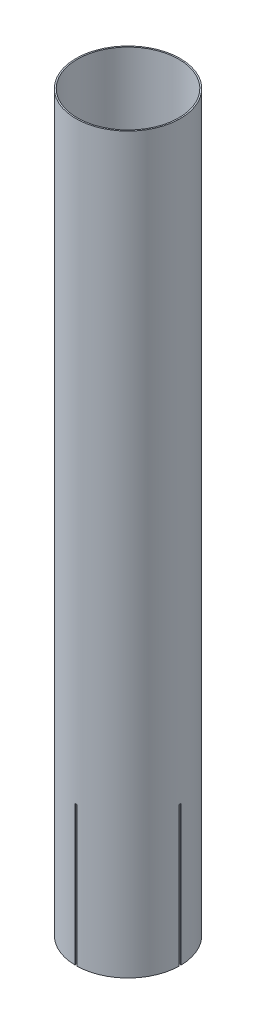
ISO-10303-21;
HEADER;
FILE_DESCRIPTION(('STEP AP214'),'2;1');
FILE_NAME('part.step','',(''),(''),'','','');
FILE_SCHEMA(('AUTOMOTIVE_DESIGN { 1 0 10303 214 1 1 1 1 }'));
ENDSEC;
DATA;
#1=APPLICATION_CONTEXT('core data for automotive mechanical design processes');
#2=APPLICATION_PROTOCOL_DEFINITION('international standard','automotive_design',2000,#1);
#3=PRODUCT_CONTEXT('',#1,'mechanical');
#4=PRODUCT('Part','Part','',(#3));
#5=PRODUCT_RELATED_PRODUCT_CATEGORY('part','',(#4));
#6=PRODUCT_DEFINITION_FORMATION('','',#4);
#7=PRODUCT_DEFINITION_CONTEXT('part definition',#1,'design');
#8=PRODUCT_DEFINITION('design','',#6,#7);
#9=PRODUCT_DEFINITION_SHAPE('','',#8);
#10=(LENGTH_UNIT() NAMED_UNIT(*) SI_UNIT(.MILLI.,.METRE.));
#11=(NAMED_UNIT(*) PLANE_ANGLE_UNIT() SI_UNIT($,.RADIAN.));
#12=(NAMED_UNIT(*) SI_UNIT($,.STERADIAN.) SOLID_ANGLE_UNIT());
#13=UNCERTAINTY_MEASURE_WITH_UNIT(LENGTH_MEASURE(1.E-05),#10,'distance_accuracy_value','');
#14=(GEOMETRIC_REPRESENTATION_CONTEXT(3) GLOBAL_UNCERTAINTY_ASSIGNED_CONTEXT((#13)) GLOBAL_UNIT_ASSIGNED_CONTEXT((#10,
#11,#12)) REPRESENTATION_CONTEXT('',''));
#15=CARTESIAN_POINT('',(0.,0.,0.));
#16=DIRECTION('',(0.,0.,1.));
#17=DIRECTION('',(1.,0.,0.));
#18=AXIS2_PLACEMENT_3D('',#15,#16,#17);
#19=CARTESIAN_POINT('',(78.2,0.,0.));
#20=DIRECTION('',(0.,-1.,0.));
#21=DIRECTION('',(0.,0.,-1.));
#22=AXIS2_PLACEMENT_3D('',#19,#20,#21);
#23=PLANE('',#22);
#24=CARTESIAN_POINT('',(0.,0.,0.));
#25=DIRECTION('',(0.,-1.,0.));
#26=DIRECTION('',(0.,0.,-1.));
#27=AXIS2_PLACEMENT_3D('',#24,#25,#26);
#28=CIRCLE('',#27,76.2);
#29=CARTESIAN_POINT('',(1.50000000000027,0.,-76.1852347899513));
#30=VERTEX_POINT('',#29);
#31=CARTESIAN_POINT('',(76.1852347899513,0.,-1.5));
#32=VERTEX_POINT('',#31);
#33=EDGE_CURVE('E233',#30,#32,#28,.T.);
#34=ORIENTED_EDGE('',*,*,#33,.F.);
#35=DIRECTION('',(0.,0.,1.));
#36=VECTOR('',#35,1.);
#37=CARTESIAN_POINT('',(1.50000000000065,0.,-185.2));
#38=LINE('',#37,#36);
#39=CARTESIAN_POINT('',(1.50000000000027,0.,-78.1856124872089));
#40=VERTEX_POINT('',#39);
#41=EDGE_CURVE('E273',#40,#30,#38,.T.);
#42=ORIENTED_EDGE('',*,*,#41,.F.);
#43=CARTESIAN_POINT('',(0.,0.,0.));
#44=DIRECTION('',(0.,-1.,0.));
#45=DIRECTION('',(0.,0.,-1.));
#46=AXIS2_PLACEMENT_3D('',#43,#44,#45);
#47=CIRCLE('',#46,78.2);
#48=CARTESIAN_POINT('',(78.1856124872089,0.,-1.5));
#49=VERTEX_POINT('',#48);
#50=EDGE_CURVE('E222',#40,#49,#47,.T.);
#51=ORIENTED_EDGE('',*,*,#50,.T.);
#52=DIRECTION('',(-1.,0.,0.));
#53=VECTOR('',#52,1.);
#54=CARTESIAN_POINT('',(185.2,0.,-1.5));
#55=LINE('',#54,#53);
#56=EDGE_CURVE('E270',#49,#32,#55,.T.);
#57=ORIENTED_EDGE('',*,*,#56,.T.);
#58=EDGE_LOOP('',(#34,#42,#51,#57));
#59=FACE_BOUND('',#58,.T.);
#60=ADVANCED_FACE('F38',(#59),#23,.T.);
#61=CARTESIAN_POINT('',(76.1852347899513,0.,1.5));
#62=VERTEX_POINT('',#61);
#63=CARTESIAN_POINT('',(1.4999999999992,0.,76.1852347899513));
#64=VERTEX_POINT('',#63);
#65=EDGE_CURVE('E180',#62,#64,#28,.T.);
#66=ORIENTED_EDGE('',*,*,#65,.F.);
#67=DIRECTION('',(-1.,0.,0.));
#68=VECTOR('',#67,1.);
#69=CARTESIAN_POINT('',(185.2,0.,1.5));
#70=LINE('',#69,#68);
#71=CARTESIAN_POINT('',(78.1856124872089,0.,1.5));
#72=VERTEX_POINT('',#71);
#73=EDGE_CURVE('E171',#72,#62,#70,.T.);
#74=ORIENTED_EDGE('',*,*,#73,.F.);
#75=CARTESIAN_POINT('',(1.49999999999918,0.,78.1856124872089));
#76=VERTEX_POINT('',#75);
#77=EDGE_CURVE('E312',#72,#76,#47,.T.);
#78=ORIENTED_EDGE('',*,*,#77,.T.);
#79=DIRECTION('',(0.,0.,-1.));
#80=VECTOR('',#79,1.);
#81=CARTESIAN_POINT('',(1.49999999999806,0.,185.2));
#82=LINE('',#81,#80);
#83=EDGE_CURVE('E172',#76,#64,#82,.T.);
#84=ORIENTED_EDGE('',*,*,#83,.T.);
#85=EDGE_LOOP('',(#66,#74,#78,#84));
#86=FACE_BOUND('',#85,.T.);
#87=ADVANCED_FACE('F332',(#86),#23,.T.);
#88=DIRECTION('',(0.,0.,1.));
#89=VECTOR('',#88,1.);
#90=CARTESIAN_POINT('',(-1.49999999999935,0.,-185.2));
#91=LINE('',#90,#89);
#92=CARTESIAN_POINT('',(-1.50000000000027,0.,76.1852347899513));
#93=VERTEX_POINT('',#92);
#94=CARTESIAN_POINT('',(-1.50000000000027,0.,78.185612487209));
#95=VERTEX_POINT('',#94);
#96=EDGE_CURVE('E279',#93,#95,#91,.T.);
#97=ORIENTED_EDGE('',*,*,#96,.T.);
#98=CARTESIAN_POINT('',(-78.1856124872089,0.,1.5));
#99=VERTEX_POINT('',#98);
#100=EDGE_CURVE('E217',#95,#99,#47,.T.);
#101=ORIENTED_EDGE('',*,*,#100,.T.);
#102=DIRECTION('',(1.,0.,0.));
#103=VECTOR('',#102,1.);
#104=CARTESIAN_POINT('',(-185.2,0.,1.5));
#105=LINE('',#104,#103);
#106=CARTESIAN_POINT('',(-76.1852347899513,0.,1.5));
#107=VERTEX_POINT('',#106);
#108=EDGE_CURVE('E202',#99,#107,#105,.T.);
#109=ORIENTED_EDGE('',*,*,#108,.T.);
#110=EDGE_CURVE('E228',#93,#107,#28,.T.);
#111=ORIENTED_EDGE('',*,*,#110,.F.);
#112=EDGE_LOOP('',(#97,#101,#109,#111));
#113=FACE_BOUND('',#112,.T.);
#114=ADVANCED_FACE('F316',(#113),#23,.T.);
#115=CARTESIAN_POINT('',(-1.49999999999973,0.,-78.1856124872089));
#116=VERTEX_POINT('',#115);
#117=CARTESIAN_POINT('',(-1.49999999999973,0.,-76.1852347899513));
#118=VERTEX_POINT('',#117);
#119=EDGE_CURVE('E281',#116,#118,#91,.T.);
#120=ORIENTED_EDGE('',*,*,#119,.T.);
#121=CARTESIAN_POINT('',(-76.1852347899513,0.,-1.5));
#122=VERTEX_POINT('',#121);
#123=EDGE_CURVE('E229',#122,#118,#28,.T.);
#124=ORIENTED_EDGE('',*,*,#123,.F.);
#125=DIRECTION('',(1.,0.,0.));
#126=VECTOR('',#125,1.);
#127=CARTESIAN_POINT('',(-185.2,0.,-1.5));
#128=LINE('',#127,#126);
#129=CARTESIAN_POINT('',(-78.1856124872089,0.,-1.5));
#130=VERTEX_POINT('',#129);
#131=EDGE_CURVE('E198',#130,#122,#128,.T.);
#132=ORIENTED_EDGE('',*,*,#131,.F.);
#133=EDGE_CURVE('E218',#130,#116,#47,.T.);
#134=ORIENTED_EDGE('',*,*,#133,.T.);
#135=EDGE_LOOP('',(#120,#124,#132,#134));
#136=FACE_BOUND('',#135,.T.);
#137=ADVANCED_FACE('F40',(#136),#23,.T.);
#138=CARTESIAN_POINT('',(0.,0.,0.));
#139=DIRECTION('',(0.,-1.,0.));
#140=DIRECTION('',(0.,0.,-1.));
#141=AXIS2_PLACEMENT_3D('',#138,#139,#140);
#142=CYLINDRICAL_SURFACE('',#141,76.2);
#143=DIRECTION('',(0.,-1.,0.));
#144=VECTOR('',#143,1.);
#145=CARTESIAN_POINT('',(-1.49999999999973,0.,-76.1852347899513));
#146=LINE('',#145,#144);
#147=CARTESIAN_POINT('',(-1.49999999999973,210.,-76.1852347899513));
#148=VERTEX_POINT('',#147);
#149=EDGE_CURVE('E195',#148,#118,#146,.T.);
#150=ORIENTED_EDGE('',*,*,#149,.F.);
#151=CARTESIAN_POINT('',(0.,210.,0.));
#152=DIRECTION('',(0.,-1.,0.));
#153=DIRECTION('',(0.,0.,-1.));
#154=AXIS2_PLACEMENT_3D('',#151,#152,#153);
#155=CIRCLE('',#154,76.2);
#156=CARTESIAN_POINT('',(1.50000000000027,210.,-76.1852347899513));
#157=VERTEX_POINT('',#156);
#158=EDGE_CURVE('E163',#148,#157,#155,.T.);
#159=ORIENTED_EDGE('',*,*,#158,.T.);
#160=DIRECTION('',(0.,-1.,0.));
#161=VECTOR('',#160,1.);
#162=CARTESIAN_POINT('',(1.50000000000027,0.,-76.1852347899513));
#163=LINE('',#162,#161);
#164=EDGE_CURVE('E190',#157,#30,#163,.T.);
#165=ORIENTED_EDGE('',*,*,#164,.T.);
#166=ORIENTED_EDGE('',*,*,#33,.T.);
#167=DIRECTION('',(0.,-1.,0.));
#168=VECTOR('',#167,1.);
#169=CARTESIAN_POINT('',(76.1852347899513,0.,-1.5));
#170=LINE('',#169,#168);
#171=CARTESIAN_POINT('',(76.1852347899513,210.,-1.5));
#172=VERTEX_POINT('',#171);
#173=EDGE_CURVE('E183',#172,#32,#170,.T.);
#174=ORIENTED_EDGE('',*,*,#173,.F.);
#175=CARTESIAN_POINT('',(76.1852347899513,210.,1.5));
#176=VERTEX_POINT('',#175);
#177=EDGE_CURVE('E162',#172,#176,#155,.T.);
#178=ORIENTED_EDGE('',*,*,#177,.T.);
#179=DIRECTION('',(0.,-1.,0.));
#180=VECTOR('',#179,1.);
#181=CARTESIAN_POINT('',(76.1852347899513,0.,1.5));
#182=LINE('',#181,#180);
#183=EDGE_CURVE('E181',#176,#62,#182,.T.);
#184=ORIENTED_EDGE('',*,*,#183,.T.);
#185=ORIENTED_EDGE('',*,*,#65,.T.);
#186=DIRECTION('',(0.,-1.,0.));
#187=VECTOR('',#186,1.);
#188=CARTESIAN_POINT('',(1.4999999999992,0.,76.1852347899513));
#189=LINE('',#188,#187);
#190=CARTESIAN_POINT('',(1.4999999999992,210.,76.1852347899513));
#191=VERTEX_POINT('',#190);
#192=EDGE_CURVE('E167',#191,#64,#189,.T.);
#193=ORIENTED_EDGE('',*,*,#192,.F.);
#194=CARTESIAN_POINT('',(-1.50000000000027,210.,76.1852347899513));
#195=VERTEX_POINT('',#194);
#196=EDGE_CURVE('E152',#191,#195,#155,.T.);
#197=ORIENTED_EDGE('',*,*,#196,.T.);
#198=DIRECTION('',(0.,-1.,0.));
#199=VECTOR('',#198,1.);
#200=CARTESIAN_POINT('',(-1.50000000000027,0.,76.1852347899513));
#201=LINE('',#200,#199);
#202=EDGE_CURVE('E193',#93,#195,#201,.F.);
#203=ORIENTED_EDGE('',*,*,#202,.F.);
#204=ORIENTED_EDGE('',*,*,#110,.T.);
#205=DIRECTION('',(0.,-1.,0.));
#206=VECTOR('',#205,1.);
#207=CARTESIAN_POINT('',(-76.1852347899513,0.,1.5));
#208=LINE('',#207,#206);
#209=CARTESIAN_POINT('',(-76.1852347899513,210.,1.5));
#210=VERTEX_POINT('',#209);
#211=EDGE_CURVE('E211',#210,#107,#208,.T.);
#212=ORIENTED_EDGE('',*,*,#211,.F.);
#213=CARTESIAN_POINT('',(0.,210.,0.));
#214=DIRECTION('',(0.,-1.,0.));
#215=DIRECTION('',(0.,0.,-1.));
#216=AXIS2_PLACEMENT_3D('',#213,#214,#215);
#217=CIRCLE('',#216,76.2);
#218=CARTESIAN_POINT('',(-76.1852347899513,210.,-1.5));
#219=VERTEX_POINT('',#218);
#220=EDGE_CURVE('E214',#210,#219,#217,.T.);
#221=ORIENTED_EDGE('',*,*,#220,.T.);
#222=DIRECTION('',(0.,-1.,0.));
#223=VECTOR('',#222,1.);
#224=CARTESIAN_POINT('',(-76.1852347899513,0.,-1.5));
#225=LINE('',#224,#223);
#226=EDGE_CURVE('E208',#219,#122,#225,.T.);
#227=ORIENTED_EDGE('',*,*,#226,.T.);
#228=ORIENTED_EDGE('',*,*,#123,.T.);
#229=EDGE_LOOP('',(#150,#159,#165,#166,#174,#178,#184,#185,#193,#197,#203,#204,#212,#221,#227,#228));
#230=FACE_BOUND('',#229,.T.);
#231=CARTESIAN_POINT('',(0.,1100.,0.));
#232=DIRECTION('',(0.,-1.,0.));
#233=DIRECTION('',(0.,0.,-1.));
#234=AXIS2_PLACEMENT_3D('',#231,#232,#233);
#235=CIRCLE('',#234,76.2);
#236=CARTESIAN_POINT('',(0.,1100.,-76.2));
#237=VERTEX_POINT('',#236);
#238=EDGE_CURVE('E225',#237,#237,#235,.T.);
#239=ORIENTED_EDGE('',*,*,#238,.F.);
#240=EDGE_LOOP('',(#239));
#241=FACE_BOUND('',#240,.T.);
#242=ADVANCED_FACE('F176',(#230,#241),#142,.F.);
#243=CARTESIAN_POINT('',(78.2,1100.,0.));
#244=DIRECTION('',(0.,1.,0.));
#245=DIRECTION('',(0.,0.,1.));
#246=AXIS2_PLACEMENT_3D('',#243,#244,#245);
#247=PLANE('',#246);
#248=ORIENTED_EDGE('',*,*,#238,.T.);
#249=EDGE_LOOP('',(#248));
#250=FACE_BOUND('',#249,.T.);
#251=CARTESIAN_POINT('',(0.,1100.,0.));
#252=DIRECTION('',(0.,-1.,0.));
#253=DIRECTION('',(0.,0.,-1.));
#254=AXIS2_PLACEMENT_3D('',#251,#252,#253);
#255=CIRCLE('',#254,78.2);
#256=CARTESIAN_POINT('',(0.,1100.,-78.2));
#257=VERTEX_POINT('',#256);
#258=EDGE_CURVE('E221',#257,#257,#255,.T.);
#259=ORIENTED_EDGE('',*,*,#258,.F.);
#260=EDGE_LOOP('',(#259));
#261=FACE_BOUND('',#260,.T.);
#262=ADVANCED_FACE('F341',(#250,#261),#247,.T.);
#263=CARTESIAN_POINT('',(0.,0.,0.));
#264=DIRECTION('',(0.,-1.,0.));
#265=DIRECTION('',(0.,0.,-1.));
#266=AXIS2_PLACEMENT_3D('',#263,#264,#265);
#267=CYLINDRICAL_SURFACE('',#266,78.2);
#268=DIRECTION('',(0.,-1.,0.));
#269=VECTOR('',#268,1.);
#270=CARTESIAN_POINT('',(-1.49999999999973,0.,-78.1856124872089));
#271=LINE('',#270,#269);
#272=CARTESIAN_POINT('',(-1.49999999999973,210.,-78.1856124872089));
#273=VERTEX_POINT('',#272);
#274=EDGE_CURVE('E11',#116,#273,#271,.F.);
#275=ORIENTED_EDGE('',*,*,#274,.F.);
#276=ORIENTED_EDGE('',*,*,#133,.F.);
#277=DIRECTION('',(0.,-1.,0.));
#278=VECTOR('',#277,1.);
#279=CARTESIAN_POINT('',(-78.1856124872089,0.,-1.5));
#280=LINE('',#279,#278);
#281=CARTESIAN_POINT('',(-78.1856124872089,210.,-1.5));
#282=VERTEX_POINT('',#281);
#283=EDGE_CURVE('E232',#130,#282,#280,.F.);
#284=ORIENTED_EDGE('',*,*,#283,.T.);
#285=CARTESIAN_POINT('',(0.,210.,0.));
#286=DIRECTION('',(0.,-1.,0.));
#287=DIRECTION('',(0.,0.,-1.));
#288=AXIS2_PLACEMENT_3D('',#285,#286,#287);
#289=CIRCLE('',#288,78.2);
#290=CARTESIAN_POINT('',(-78.1856124872089,210.,1.5));
#291=VERTEX_POINT('',#290);
#292=EDGE_CURVE('E236',#282,#291,#289,.F.);
#293=ORIENTED_EDGE('',*,*,#292,.T.);
#294=DIRECTION('',(0.,-1.,0.));
#295=VECTOR('',#294,1.);
#296=CARTESIAN_POINT('',(-78.1856124872089,0.,1.5));
#297=LINE('',#296,#295);
#298=EDGE_CURVE('E238',#99,#291,#297,.F.);
#299=ORIENTED_EDGE('',*,*,#298,.F.);
#300=ORIENTED_EDGE('',*,*,#100,.F.);
#301=DIRECTION('',(0.,-1.,0.));
#302=VECTOR('',#301,1.);
#303=CARTESIAN_POINT('',(-1.50000000000027,0.,78.1856124872089));
#304=LINE('',#303,#302);
#305=CARTESIAN_POINT('',(-1.50000000000027,210.,78.1856124872089));
#306=VERTEX_POINT('',#305);
#307=EDGE_CURVE('E244',#306,#95,#304,.T.);
#308=ORIENTED_EDGE('',*,*,#307,.F.);
#309=CARTESIAN_POINT('',(0.,210.,0.));
#310=DIRECTION('',(0.,-1.,0.));
#311=DIRECTION('',(0.,0.,-1.));
#312=AXIS2_PLACEMENT_3D('',#309,#310,#311);
#313=CIRCLE('',#312,78.2);
#314=CARTESIAN_POINT('',(1.49999999999918,210.,78.185612487209));
#315=VERTEX_POINT('',#314);
#316=EDGE_CURVE('E242',#306,#315,#313,.F.);
#317=ORIENTED_EDGE('',*,*,#316,.T.);
#318=DIRECTION('',(0.,-1.,0.));
#319=VECTOR('',#318,1.);
#320=CARTESIAN_POINT('',(1.49999999999918,0.,78.185612487209));
#321=LINE('',#320,#319);
#322=EDGE_CURVE('E170',#76,#315,#321,.F.);
#323=ORIENTED_EDGE('',*,*,#322,.F.);
#324=ORIENTED_EDGE('',*,*,#77,.F.);
#325=DIRECTION('',(0.,-1.,0.));
#326=VECTOR('',#325,1.);
#327=CARTESIAN_POINT('',(78.1856124872089,0.,1.5));
#328=LINE('',#327,#326);
#329=CARTESIAN_POINT('',(78.1856124872089,210.,1.5));
#330=VERTEX_POINT('',#329);
#331=EDGE_CURVE('E247',#72,#330,#328,.F.);
#332=ORIENTED_EDGE('',*,*,#331,.T.);
#333=CARTESIAN_POINT('',(78.1856124872089,210.,-1.5));
#334=VERTEX_POINT('',#333);
#335=EDGE_CURVE('E245',#330,#334,#313,.F.);
#336=ORIENTED_EDGE('',*,*,#335,.T.);
#337=DIRECTION('',(0.,-1.,0.));
#338=VECTOR('',#337,1.);
#339=CARTESIAN_POINT('',(78.1856124872089,0.,-1.5));
#340=LINE('',#339,#338);
#341=EDGE_CURVE('E250',#49,#334,#340,.F.);
#342=ORIENTED_EDGE('',*,*,#341,.F.);
#343=ORIENTED_EDGE('',*,*,#50,.F.);
#344=DIRECTION('',(0.,-1.,0.));
#345=VECTOR('',#344,1.);
#346=CARTESIAN_POINT('',(1.50000000000027,0.,-78.1856124872089));
#347=LINE('',#346,#345);
#348=CARTESIAN_POINT('',(1.50000000000027,210.,-78.1856124872089));
#349=VERTEX_POINT('',#348);
#350=EDGE_CURVE('E252',#40,#349,#347,.F.);
#351=ORIENTED_EDGE('',*,*,#350,.T.);
#352=EDGE_CURVE('E46',#349,#273,#313,.F.);
#353=ORIENTED_EDGE('',*,*,#352,.T.);
#354=EDGE_LOOP('',(#275,#276,#284,#293,#299,#300,#308,#317,#323,#324,#332,#336,#342,#343,#351,#353));
#355=FACE_BOUND('',#354,.T.);
#356=ORIENTED_EDGE('',*,*,#258,.T.);
#357=EDGE_LOOP('',(#356));
#358=FACE_BOUND('',#357,.T.);
#359=ADVANCED_FACE('F258',(#355,#358),#267,.T.);
#360=CARTESIAN_POINT('',(-78.2000000000001,210.,1.5));
#361=DIRECTION('',(0.,-1.,0.));
#362=DIRECTION('',(0.,0.,-1.));
#363=AXIS2_PLACEMENT_3D('',#360,#361,#362);
#364=PLANE('',#363);
#365=DIRECTION('',(-1.,0.,0.));
#366=VECTOR('',#365,1.);
#367=CARTESIAN_POINT('',(-78.2000000000001,210.,1.5));
#368=LINE('',#367,#366);
#369=EDGE_CURVE('E205',#210,#291,#368,.T.);
#370=ORIENTED_EDGE('',*,*,#369,.T.);
#371=ORIENTED_EDGE('',*,*,#292,.F.);
#372=DIRECTION('',(-1.,0.,0.));
#373=VECTOR('',#372,1.);
#374=CARTESIAN_POINT('',(-78.2000000000001,210.,-1.5));
#375=LINE('',#374,#373);
#376=EDGE_CURVE('E200',#219,#282,#375,.T.);
#377=ORIENTED_EDGE('',*,*,#376,.F.);
#378=ORIENTED_EDGE('',*,*,#220,.F.);
#379=EDGE_LOOP('',(#370,#371,#377,#378));
#380=FACE_BOUND('',#379,.T.);
#381=ADVANCED_FACE('F302',(#380),#364,.T.);
#382=CARTESIAN_POINT('',(0.,0.,1.5));
#383=DIRECTION('',(0.,0.,1.));
#384=DIRECTION('',(1.,0.,0.));
#385=AXIS2_PLACEMENT_3D('',#382,#383,#384);
#386=PLANE('',#385);
#387=ORIENTED_EDGE('',*,*,#211,.T.);
#388=ORIENTED_EDGE('',*,*,#108,.F.);
#389=ORIENTED_EDGE('',*,*,#298,.T.);
#390=ORIENTED_EDGE('',*,*,#369,.F.);
#391=EDGE_LOOP('',(#387,#388,#389,#390));
#392=FACE_BOUND('',#391,.T.);
#393=ADVANCED_FACE('F306',(#392),#386,.F.);
#394=CARTESIAN_POINT('',(0.,0.,-1.5));
#395=DIRECTION('',(0.,0.,1.));
#396=DIRECTION('',(1.,0.,0.));
#397=AXIS2_PLACEMENT_3D('',#394,#395,#396);
#398=PLANE('',#397);
#399=ORIENTED_EDGE('',*,*,#376,.T.);
#400=ORIENTED_EDGE('',*,*,#283,.F.);
#401=ORIENTED_EDGE('',*,*,#131,.T.);
#402=ORIENTED_EDGE('',*,*,#226,.F.);
#403=EDGE_LOOP('',(#399,#400,#401,#402));
#404=FACE_BOUND('',#403,.T.);
#405=ADVANCED_FACE('F299',(#404),#398,.T.);
#406=CARTESIAN_POINT('',(-1.5,0.,0.));
#407=DIRECTION('',(-1.,0.,0.));
#408=DIRECTION('',(0.,0.,1.));
#409=AXIS2_PLACEMENT_3D('',#406,#407,#408);
#410=PLANE('',#409);
#411=ORIENTED_EDGE('',*,*,#202,.T.);
#412=DIRECTION('',(0.,0.,-1.));
#413=VECTOR('',#412,1.);
#414=CARTESIAN_POINT('',(-1.49999999999973,210.,-78.2000000000001));
#415=LINE('',#414,#413);
#416=EDGE_CURVE('E158',#306,#195,#415,.T.);
#417=ORIENTED_EDGE('',*,*,#416,.F.);
#418=ORIENTED_EDGE('',*,*,#307,.T.);
#419=ORIENTED_EDGE('',*,*,#96,.F.);
#420=EDGE_LOOP('',(#411,#417,#418,#419));
#421=FACE_BOUND('',#420,.T.);
#422=ADVANCED_FACE('F319',(#421),#410,.F.);
#423=CARTESIAN_POINT('',(1.5,0.,0.));
#424=DIRECTION('',(1.,0.,0.));
#425=DIRECTION('',(0.,0.,-1.));
#426=AXIS2_PLACEMENT_3D('',#423,#424,#425);
#427=PLANE('',#426);
#428=ORIENTED_EDGE('',*,*,#192,.T.);
#429=ORIENTED_EDGE('',*,*,#83,.F.);
#430=ORIENTED_EDGE('',*,*,#322,.T.);
#431=DIRECTION('',(0.,0.,1.));
#432=VECTOR('',#431,1.);
#433=CARTESIAN_POINT('',(1.49999999999918,210.,78.2000000000001));
#434=LINE('',#433,#432);
#435=EDGE_CURVE('E155',#191,#315,#434,.T.);
#436=ORIENTED_EDGE('',*,*,#435,.F.);
#437=EDGE_LOOP('',(#428,#429,#430,#436));
#438=FACE_BOUND('',#437,.T.);
#439=ADVANCED_FACE('F166',(#438),#427,.F.);
#440=CARTESIAN_POINT('',(-1.49999999999973,210.,-78.2000000000001));
#441=DIRECTION('',(0.,-1.,0.));
#442=DIRECTION('',(0.,0.,-1.));
#443=AXIS2_PLACEMENT_3D('',#440,#441,#442);
#444=PLANE('',#443);
#445=ORIENTED_EDGE('',*,*,#435,.T.);
#446=ORIENTED_EDGE('',*,*,#316,.F.);
#447=ORIENTED_EDGE('',*,*,#416,.T.);
#448=ORIENTED_EDGE('',*,*,#196,.F.);
#449=EDGE_LOOP('',(#445,#446,#447,#448));
#450=FACE_BOUND('',#449,.T.);
#451=ADVANCED_FACE('F154',(#450),#444,.T.);
#452=CARTESIAN_POINT('',(0.,0.,1.5));
#453=DIRECTION('',(0.,0.,-1.));
#454=DIRECTION('',(-1.,0.,0.));
#455=AXIS2_PLACEMENT_3D('',#452,#453,#454);
#456=PLANE('',#455);
#457=DIRECTION('',(1.,0.,0.));
#458=VECTOR('',#457,1.);
#459=CARTESIAN_POINT('',(78.2000000000001,210.,1.5));
#460=LINE('',#459,#458);
#461=EDGE_CURVE('E61',#176,#330,#460,.T.);
#462=ORIENTED_EDGE('',*,*,#461,.T.);
#463=ORIENTED_EDGE('',*,*,#331,.F.);
#464=ORIENTED_EDGE('',*,*,#73,.T.);
#465=ORIENTED_EDGE('',*,*,#183,.F.);
#466=EDGE_LOOP('',(#462,#463,#464,#465));
#467=FACE_BOUND('',#466,.T.);
#468=ADVANCED_FACE('F416',(#467),#456,.T.);
#469=CARTESIAN_POINT('',(0.,0.,-1.5));
#470=DIRECTION('',(0.,0.,-1.));
#471=DIRECTION('',(-1.,0.,0.));
#472=AXIS2_PLACEMENT_3D('',#469,#470,#471);
#473=PLANE('',#472);
#474=ORIENTED_EDGE('',*,*,#173,.T.);
#475=ORIENTED_EDGE('',*,*,#56,.F.);
#476=ORIENTED_EDGE('',*,*,#341,.T.);
#477=DIRECTION('',(1.,0.,0.));
#478=VECTOR('',#477,1.);
#479=CARTESIAN_POINT('',(78.2000000000001,210.,-1.5));
#480=LINE('',#479,#478);
#481=EDGE_CURVE('E267',#172,#334,#480,.T.);
#482=ORIENTED_EDGE('',*,*,#481,.F.);
#483=EDGE_LOOP('',(#474,#475,#476,#482));
#484=FACE_BOUND('',#483,.T.);
#485=ADVANCED_FACE('F266',(#484),#473,.F.);
#486=ORIENTED_EDGE('',*,*,#481,.T.);
#487=ORIENTED_EDGE('',*,*,#335,.F.);
#488=ORIENTED_EDGE('',*,*,#461,.F.);
#489=ORIENTED_EDGE('',*,*,#177,.F.);
#490=EDGE_LOOP('',(#486,#487,#488,#489));
#491=FACE_BOUND('',#490,.T.);
#492=ADVANCED_FACE('F271',(#491),#444,.T.);
#493=ORIENTED_EDGE('',*,*,#149,.T.);
#494=ORIENTED_EDGE('',*,*,#119,.F.);
#495=ORIENTED_EDGE('',*,*,#274,.T.);
#496=EDGE_CURVE('E185',#148,#273,#415,.T.);
#497=ORIENTED_EDGE('',*,*,#496,.F.);
#498=EDGE_LOOP('',(#493,#494,#495,#497));
#499=FACE_BOUND('',#498,.T.);
#500=ADVANCED_FACE('F293',(#499),#410,.F.);
#501=ORIENTED_EDGE('',*,*,#496,.T.);
#502=ORIENTED_EDGE('',*,*,#352,.F.);
#503=DIRECTION('',(0.,0.,-1.));
#504=VECTOR('',#503,1.);
#505=CARTESIAN_POINT('',(1.50000000000027,210.,-78.2000000000001));
#506=LINE('',#505,#504);
#507=EDGE_CURVE('E53',#157,#349,#506,.T.);
#508=ORIENTED_EDGE('',*,*,#507,.F.);
#509=ORIENTED_EDGE('',*,*,#158,.F.);
#510=EDGE_LOOP('',(#501,#502,#508,#509));
#511=FACE_BOUND('',#510,.T.);
#512=ADVANCED_FACE('F291',(#511),#444,.T.);
#513=CARTESIAN_POINT('',(1.5,0.,0.));
#514=DIRECTION('',(-1.,0.,0.));
#515=DIRECTION('',(0.,0.,1.));
#516=AXIS2_PLACEMENT_3D('',#513,#514,#515);
#517=PLANE('',#516);
#518=ORIENTED_EDGE('',*,*,#507,.T.);
#519=ORIENTED_EDGE('',*,*,#350,.F.);
#520=ORIENTED_EDGE('',*,*,#41,.T.);
#521=ORIENTED_EDGE('',*,*,#164,.F.);
#522=EDGE_LOOP('',(#518,#519,#520,#521));
#523=FACE_BOUND('',#522,.T.);
#524=ADVANCED_FACE('F458',(#523),#517,.T.);
#525=CLOSED_SHELL('',(#60,#87,#114,#137,#242,#262,#359,#381,#393,#405,#422,#439,#451,#468,#485,
#492,#500,#512,#524));
#526=MANIFOLD_SOLID_BREP('B2',#525);
#527=ADVANCED_BREP_SHAPE_REPRESENTATION('',(#18,#526),#14);
#528=SHAPE_DEFINITION_REPRESENTATION(#9,#527);
ENDSEC;
END-ISO-10303-21;
